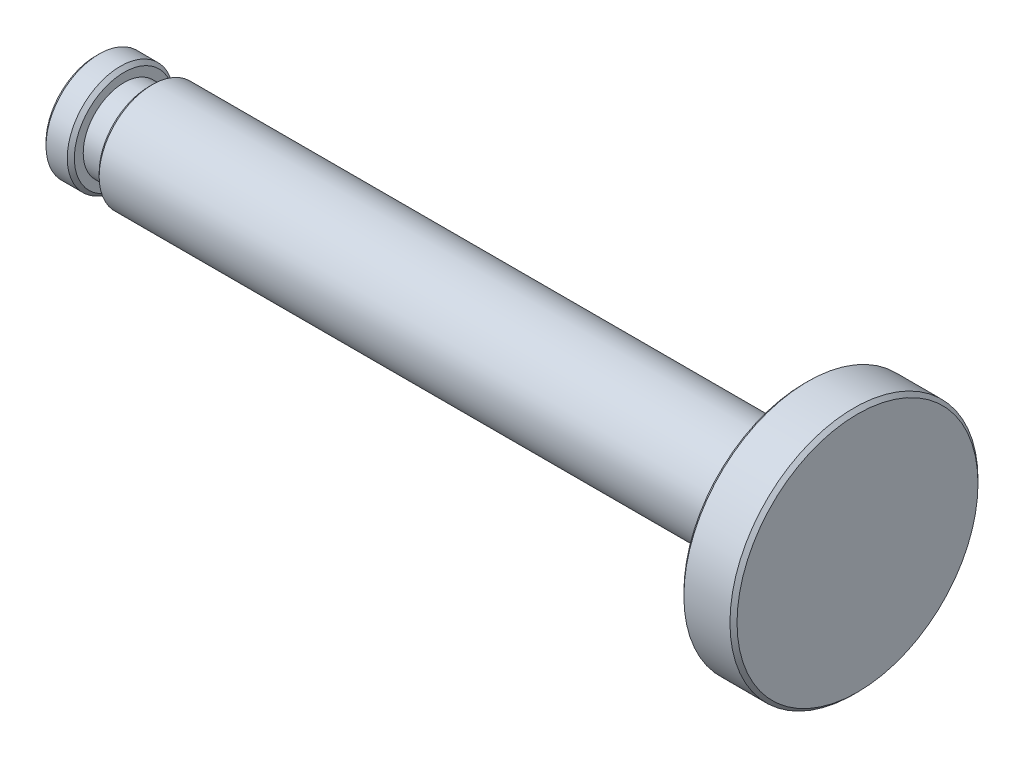
ISO-10303-21;
HEADER;
FILE_DESCRIPTION(('STEP AP214'),'2;1');
FILE_NAME('part.step','',(''),(''),'','','');
FILE_SCHEMA(('AUTOMOTIVE_DESIGN { 1 0 10303 214 1 1 1 1 }'));
ENDSEC;
DATA;
#1=APPLICATION_CONTEXT('core data for automotive mechanical design processes');
#2=APPLICATION_PROTOCOL_DEFINITION('international standard','automotive_design',2000,#1);
#3=PRODUCT_CONTEXT('',#1,'mechanical');
#4=PRODUCT('Part','Part','',(#3));
#5=PRODUCT_RELATED_PRODUCT_CATEGORY('part','',(#4));
#6=PRODUCT_DEFINITION_FORMATION('','',#4);
#7=PRODUCT_DEFINITION_CONTEXT('part definition',#1,'design');
#8=PRODUCT_DEFINITION('design','',#6,#7);
#9=PRODUCT_DEFINITION_SHAPE('','',#8);
#10=(LENGTH_UNIT() NAMED_UNIT(*) SI_UNIT(.MILLI.,.METRE.));
#11=(NAMED_UNIT(*) PLANE_ANGLE_UNIT() SI_UNIT($,.RADIAN.));
#12=(NAMED_UNIT(*) SI_UNIT($,.STERADIAN.) SOLID_ANGLE_UNIT());
#13=UNCERTAINTY_MEASURE_WITH_UNIT(LENGTH_MEASURE(1.E-05),#10,'distance_accuracy_value','');
#14=(GEOMETRIC_REPRESENTATION_CONTEXT(3) GLOBAL_UNCERTAINTY_ASSIGNED_CONTEXT((#13)) GLOBAL_UNIT_ASSIGNED_CONTEXT((#10,
#11,#12)) REPRESENTATION_CONTEXT('',''));
#15=CARTESIAN_POINT('',(0.,0.,0.));
#16=DIRECTION('',(0.,0.,1.));
#17=DIRECTION('',(1.,0.,0.));
#18=AXIS2_PLACEMENT_3D('',#15,#16,#17);
#19=CARTESIAN_POINT('',(-10.75,1.5,0.));
#20=DIRECTION('',(-1.,0.,0.));
#21=DIRECTION('',(0.,0.,1.));
#22=AXIS2_PLACEMENT_3D('',#19,#20,#21);
#23=PLANE('',#22);
#24=CARTESIAN_POINT('',(-10.7499999999732,0.,0.));
#25=DIRECTION('',(1.,0.,0.));
#26=DIRECTION('',(0.,0.,-1.));
#27=AXIS2_PLACEMENT_3D('',#24,#25,#26);
#28=CIRCLE('',#27,1.40000000004648);
#29=CARTESIAN_POINT('',(-10.7499999999732,0.,1.40000000004648));
#30=VERTEX_POINT('',#29);
#31=EDGE_CURVE('E11',#30,#30,#28,.T.);
#32=ORIENTED_EDGE('',*,*,#31,.F.);
#33=EDGE_LOOP('',(#32));
#34=FACE_BOUND('',#33,.T.);
#35=ADVANCED_FACE('F17',(#34),#23,.T.);
#36=CARTESIAN_POINT('',(10.75,3.5,0.));
#37=DIRECTION('',(1.,0.,0.));
#38=DIRECTION('',(0.,1.,0.));
#39=AXIS2_PLACEMENT_3D('',#36,#37,#38);
#40=PLANE('',#39);
#41=CARTESIAN_POINT('',(10.7499999999732,0.,0.));
#42=DIRECTION('',(-1.,0.,0.));
#43=DIRECTION('',(0.,0.,1.));
#44=AXIS2_PLACEMENT_3D('',#41,#42,#43);
#45=CIRCLE('',#44,3.39999999999918);
#46=CARTESIAN_POINT('',(10.7499999999732,0.,-3.39999999999918));
#47=VERTEX_POINT('',#46);
#48=EDGE_CURVE('E98',#47,#47,#45,.T.);
#49=ORIENTED_EDGE('',*,*,#48,.F.);
#50=EDGE_LOOP('',(#49));
#51=FACE_BOUND('',#50,.T.);
#52=ADVANCED_FACE('F196',(#51),#40,.T.);
#53=CARTESIAN_POINT('',(-9.95,1.15,0.));
#54=DIRECTION('',(1.,0.,0.));
#55=DIRECTION('',(0.,1.,0.));
#56=AXIS2_PLACEMENT_3D('',#53,#54,#55);
#57=PLANE('',#56);
#58=CARTESIAN_POINT('',(-9.95,0.,0.));
#59=DIRECTION('',(1.,0.,0.));
#60=DIRECTION('',(0.,0.,-1.));
#61=AXIS2_PLACEMENT_3D('',#58,#59,#60);
#62=CIRCLE('',#61,1.15);
#63=CARTESIAN_POINT('',(-9.95,0.,1.15));
#64=VERTEX_POINT('',#63);
#65=EDGE_CURVE('E120',#64,#64,#62,.T.);
#66=ORIENTED_EDGE('',*,*,#65,.F.);
#67=EDGE_LOOP('',(#66));
#68=FACE_BOUND('',#67,.T.);
#69=CARTESIAN_POINT('',(-9.94999999994661,0.,0.));
#70=DIRECTION('',(1.,0.,0.));
#71=DIRECTION('',(0.,0.,1.));
#72=AXIS2_PLACEMENT_3D('',#69,#70,#71);
#73=CIRCLE('',#72,1.39999999993279);
#74=CARTESIAN_POINT('',(-9.94999999994661,0.,-1.39999999993279));
#75=VERTEX_POINT('',#74);
#76=EDGE_CURVE('E162',#75,#75,#73,.T.);
#77=ORIENTED_EDGE('',*,*,#76,.T.);
#78=EDGE_LOOP('',(#77));
#79=FACE_BOUND('',#78,.T.);
#80=ADVANCED_FACE('F201',(#68,#79),#57,.T.);
#81=CARTESIAN_POINT('',(-9.25,1.5,0.));
#82=DIRECTION('',(-1.,0.,0.));
#83=DIRECTION('',(0.,0.,1.));
#84=AXIS2_PLACEMENT_3D('',#81,#82,#83);
#85=PLANE('',#84);
#86=CARTESIAN_POINT('',(-9.25,0.,0.));
#87=DIRECTION('',(1.,0.,0.));
#88=DIRECTION('',(0.,0.,-1.));
#89=AXIS2_PLACEMENT_3D('',#86,#87,#88);
#90=CIRCLE('',#89,1.15);
#91=CARTESIAN_POINT('',(-9.25,0.,1.15));
#92=VERTEX_POINT('',#91);
#93=EDGE_CURVE('E155',#92,#92,#90,.T.);
#94=ORIENTED_EDGE('',*,*,#93,.T.);
#95=EDGE_LOOP('',(#94));
#96=FACE_BOUND('',#95,.T.);
#97=CARTESIAN_POINT('',(-9.25000000000864,0.,0.));
#98=DIRECTION('',(1.,0.,0.));
#99=DIRECTION('',(0.,0.,-1.));
#100=AXIS2_PLACEMENT_3D('',#97,#98,#99);
#101=CIRCLE('',#100,1.40000000004648);
#102=CARTESIAN_POINT('',(-9.25000000000864,0.,1.40000000004648));
#103=VERTEX_POINT('',#102);
#104=EDGE_CURVE('E20',#103,#103,#101,.T.);
#105=ORIENTED_EDGE('',*,*,#104,.F.);
#106=EDGE_LOOP('',(#105));
#107=FACE_BOUND('',#106,.T.);
#108=ADVANCED_FACE('F190',(#96,#107),#85,.T.);
#109=CARTESIAN_POINT('',(9.25,1.5,0.));
#110=DIRECTION('',(-1.,0.,0.));
#111=DIRECTION('',(0.,0.,1.));
#112=AXIS2_PLACEMENT_3D('',#109,#110,#111);
#113=PLANE('',#112);
#114=CARTESIAN_POINT('',(9.25,0.,0.));
#115=DIRECTION('',(-1.,0.,0.));
#116=DIRECTION('',(0.,0.,-1.));
#117=AXIS2_PLACEMENT_3D('',#114,#115,#116);
#118=CIRCLE('',#117,1.5);
#119=CARTESIAN_POINT('',(9.25,0.,1.5));
#120=VERTEX_POINT('',#119);
#121=EDGE_CURVE('E146',#120,#120,#118,.T.);
#122=ORIENTED_EDGE('',*,*,#121,.F.);
#123=EDGE_LOOP('',(#122));
#124=FACE_BOUND('',#123,.T.);
#125=CARTESIAN_POINT('',(9.25000000000864,0.,0.));
#126=DIRECTION('',(-1.,0.,0.));
#127=DIRECTION('',(0.,0.,-1.));
#128=AXIS2_PLACEMENT_3D('',#125,#126,#127);
#129=CIRCLE('',#128,3.39999999999918);
#130=CARTESIAN_POINT('',(9.25000000000864,0.,3.39999999999918));
#131=VERTEX_POINT('',#130);
#132=EDGE_CURVE('E129',#131,#131,#129,.T.);
#133=ORIENTED_EDGE('',*,*,#132,.T.);
#134=EDGE_LOOP('',(#133));
#135=FACE_BOUND('',#134,.T.);
#136=ADVANCED_FACE('F181',(#124,#135),#113,.T.);
#137=CARTESIAN_POINT('',(-10.650000000112,0.,0.));
#138=DIRECTION('',(1.,0.,0.));
#139=DIRECTION('',(0.,0.,-1.));
#140=AXIS2_PLACEMENT_3D('',#137,#138,#139);
#141=CONICAL_SURFACE('',#140,1.49999999990769,0.785398163397448);
#142=CARTESIAN_POINT('',(-10.65,0.,0.));
#143=DIRECTION('',(1.,0.,0.));
#144=DIRECTION('',(0.,0.,-1.));
#145=AXIS2_PLACEMENT_3D('',#142,#143,#144);
#146=CIRCLE('',#145,1.5);
#147=CARTESIAN_POINT('',(-10.65,0.,1.5));
#148=VERTEX_POINT('',#147);
#149=EDGE_CURVE('E142',#148,#148,#146,.T.);
#150=ORIENTED_EDGE('',*,*,#149,.F.);
#151=DIRECTION('',(-0.707106781186548,0.,-0.707106781186548));
#152=VECTOR('',#151,1.);
#153=CARTESIAN_POINT('',(-10.650000000112,0.,1.49999999990769));
#154=LINE('',#153,#152);
#155=EDGE_CURVE('E26',#148,#30,#154,.T.);
#156=ORIENTED_EDGE('',*,*,#155,.T.);
#157=ORIENTED_EDGE('',*,*,#31,.T.);
#158=ORIENTED_EDGE('',*,*,#155,.F.);
#159=EDGE_LOOP('',(#150,#156,#157,#158));
#160=FACE_BOUND('',#159,.T.);
#161=ADVANCED_FACE('F179',(#160),#141,.T.);
#162=CARTESIAN_POINT('',(43.7434951565,0.,0.));
#163=DIRECTION('',(1.,0.,0.));
#164=DIRECTION('',(0.,0.,-1.));
#165=AXIS2_PLACEMENT_3D('',#162,#163,#164);
#166=CYLINDRICAL_SURFACE('',#165,1.5);
#167=CARTESIAN_POINT('',(-10.0499999999784,0.,0.));
#168=DIRECTION('',(1.,0.,0.));
#169=DIRECTION('',(0.,-1.,0.));
#170=AXIS2_PLACEMENT_3D('',#167,#168,#169);
#171=CIRCLE('',#170,1.49999999996453);
#172=CARTESIAN_POINT('',(-10.0499999999784,0.,1.49999999996453));
#173=VERTEX_POINT('',#172);
#174=CARTESIAN_POINT('',(-10.0499999999784,0.,-1.49999999996453));
#175=VERTEX_POINT('',#174);
#176=EDGE_CURVE('E105',#173,#175,#171,.T.);
#177=ORIENTED_EDGE('',*,*,#176,.F.);
#178=DIRECTION('',(-1.,0.,0.));
#179=VECTOR('',#178,1.);
#180=CARTESIAN_POINT('',(43.7434951565,0.,1.5));
#181=LINE('',#180,#179);
#182=EDGE_CURVE('E147',#173,#148,#181,.T.);
#183=ORIENTED_EDGE('',*,*,#182,.T.);
#184=ORIENTED_EDGE('',*,*,#149,.T.);
#185=ORIENTED_EDGE('',*,*,#182,.F.);
#186=CARTESIAN_POINT('',(-10.0499999999784,0.,0.));
#187=DIRECTION('',(1.,0.,0.));
#188=DIRECTION('',(0.,-1.,0.));
#189=AXIS2_PLACEMENT_3D('',#186,#187,#188);
#190=CIRCLE('',#189,1.49999999996453);
#191=EDGE_CURVE('E151',#175,#173,#190,.T.);
#192=ORIENTED_EDGE('',*,*,#191,.F.);
#193=EDGE_LOOP('',(#177,#183,#184,#185,#192));
#194=FACE_BOUND('',#193,.T.);
#195=ADVANCED_FACE('F178',(#194),#166,.T.);
#196=CARTESIAN_POINT('',(-10.0499999999215,0.,0.));
#197=DIRECTION('',(-1.,0.,0.));
#198=DIRECTION('',(0.,0.,1.));
#199=AXIS2_PLACEMENT_3D('',#196,#197,#198);
#200=CONICAL_SURFACE('',#199,1.49999999990769,0.785398163397448);
#201=ORIENTED_EDGE('',*,*,#176,.T.);
#202=DIRECTION('',(0.707106781186548,0.,0.707106781186548));
#203=VECTOR('',#202,1.);
#204=CARTESIAN_POINT('',(-10.0499999999215,0.,-1.49999999990769));
#205=LINE('',#204,#203);
#206=EDGE_CURVE('E113',#175,#75,#205,.T.);
#207=ORIENTED_EDGE('',*,*,#206,.T.);
#208=ORIENTED_EDGE('',*,*,#76,.F.);
#209=ORIENTED_EDGE('',*,*,#206,.F.);
#210=ORIENTED_EDGE('',*,*,#191,.T.);
#211=EDGE_LOOP('',(#201,#207,#208,#209,#210));
#212=FACE_BOUND('',#211,.T.);
#213=ADVANCED_FACE('F188',(#212),#200,.T.);
#214=CARTESIAN_POINT('',(10.6500000000551,0.,0.));
#215=DIRECTION('',(-1.,0.,0.));
#216=DIRECTION('',(0.,0.,1.));
#217=AXIS2_PLACEMENT_3D('',#214,#215,#216);
#218=CONICAL_SURFACE('',#217,3.49999999997408,0.785398163681665);
#219=CARTESIAN_POINT('',(10.65,0.,0.));
#220=DIRECTION('',(-1.,0.,0.));
#221=DIRECTION('',(0.,0.,-1.));
#222=AXIS2_PLACEMENT_3D('',#219,#220,#221);
#223=CIRCLE('',#222,3.5);
#224=CARTESIAN_POINT('',(10.65,0.,-3.5000000000292));
#225=VERTEX_POINT('',#224);
#226=CARTESIAN_POINT('',(10.65,0.,3.5));
#227=VERTEX_POINT('',#226);
#228=EDGE_CURVE('E123',#225,#227,#223,.T.);
#229=ORIENTED_EDGE('',*,*,#228,.F.);
#230=DIRECTION('',(0.707106780985576,0.,0.707106781387519));
#231=VECTOR('',#230,1.);
#232=CARTESIAN_POINT('',(10.6500000000551,0.,-3.49999999997408));
#233=LINE('',#232,#231);
#234=EDGE_CURVE('E101',#225,#47,#233,.T.);
#235=ORIENTED_EDGE('',*,*,#234,.T.);
#236=ORIENTED_EDGE('',*,*,#48,.T.);
#237=ORIENTED_EDGE('',*,*,#234,.F.);
#238=CARTESIAN_POINT('',(10.65,0.,0.));
#239=DIRECTION('',(-1.,0.,0.));
#240=DIRECTION('',(0.,0.,-1.));
#241=AXIS2_PLACEMENT_3D('',#238,#239,#240);
#242=CIRCLE('',#241,3.5);
#243=EDGE_CURVE('E115',#227,#225,#242,.T.);
#244=ORIENTED_EDGE('',*,*,#243,.F.);
#245=EDGE_LOOP('',(#229,#235,#236,#237,#244));
#246=FACE_BOUND('',#245,.T.);
#247=ADVANCED_FACE('F100',(#246),#218,.T.);
#248=CARTESIAN_POINT('',(43.7434951565,0.,0.));
#249=DIRECTION('',(1.,0.,0.));
#250=DIRECTION('',(0.,0.,-1.));
#251=AXIS2_PLACEMENT_3D('',#248,#249,#250);
#252=CYLINDRICAL_SURFACE('',#251,3.5);
#253=ORIENTED_EDGE('',*,*,#228,.T.);
#254=DIRECTION('',(-1.,0.,0.));
#255=VECTOR('',#254,1.);
#256=CARTESIAN_POINT('',(43.7434951565,0.,3.5));
#257=LINE('',#256,#255);
#258=CARTESIAN_POINT('',(9.34999999998354,0.,3.49999999997408));
#259=VERTEX_POINT('',#258);
#260=EDGE_CURVE('E161',#227,#259,#257,.T.);
#261=ORIENTED_EDGE('',*,*,#260,.T.);
#262=CARTESIAN_POINT('',(9.34999999998354,0.,0.));
#263=DIRECTION('',(-1.,0.,0.));
#264=DIRECTION('',(0.,1.,0.));
#265=AXIS2_PLACEMENT_3D('',#262,#263,#264);
#266=CIRCLE('',#265,3.49999999997408);
#267=EDGE_CURVE('E130',#259,#259,#266,.T.);
#268=ORIENTED_EDGE('',*,*,#267,.F.);
#269=ORIENTED_EDGE('',*,*,#260,.F.);
#270=ORIENTED_EDGE('',*,*,#243,.T.);
#271=EDGE_LOOP('',(#253,#261,#268,#269,#270));
#272=FACE_BOUND('',#271,.T.);
#273=ADVANCED_FACE('F214',(#272),#252,.T.);
#274=CARTESIAN_POINT('',(43.7434951565,0.,0.));
#275=DIRECTION('',(1.,0.,0.));
#276=DIRECTION('',(0.,0.,-1.));
#277=AXIS2_PLACEMENT_3D('',#274,#275,#276);
#278=CYLINDRICAL_SURFACE('',#277,1.15);
#279=ORIENTED_EDGE('',*,*,#93,.F.);
#280=DIRECTION('',(-1.,0.,0.));
#281=VECTOR('',#280,1.);
#282=CARTESIAN_POINT('',(43.7434951565,0.,1.15));
#283=LINE('',#282,#281);
#284=EDGE_CURVE('E124',#92,#64,#283,.T.);
#285=ORIENTED_EDGE('',*,*,#284,.T.);
#286=ORIENTED_EDGE('',*,*,#65,.T.);
#287=ORIENTED_EDGE('',*,*,#284,.F.);
#288=EDGE_LOOP('',(#279,#285,#286,#287));
#289=FACE_BOUND('',#288,.T.);
#290=ADVANCED_FACE('F211',(#289),#278,.T.);
#291=CARTESIAN_POINT('',(9.34999999986985,0.,0.));
#292=DIRECTION('',(1.,0.,0.));
#293=DIRECTION('',(0.,0.,-1.));
#294=AXIS2_PLACEMENT_3D('',#291,#292,#293);
#295=CONICAL_SURFACE('',#294,3.49999999986039,0.785398163397448);
#296=ORIENTED_EDGE('',*,*,#267,.T.);
#297=DIRECTION('',(-0.707106781186548,0.,-0.707106781186548));
#298=VECTOR('',#297,1.);
#299=CARTESIAN_POINT('',(9.34999999986985,0.,3.49999999986039));
#300=LINE('',#299,#298);
#301=EDGE_CURVE('E125',#259,#131,#300,.T.);
#302=ORIENTED_EDGE('',*,*,#301,.T.);
#303=ORIENTED_EDGE('',*,*,#132,.F.);
#304=ORIENTED_EDGE('',*,*,#301,.F.);
#305=EDGE_LOOP('',(#296,#302,#303,#304));
#306=FACE_BOUND('',#305,.T.);
#307=ADVANCED_FACE('F209',(#306),#295,.T.);
#308=CARTESIAN_POINT('',(-9.15000000014743,0.,0.));
#309=DIRECTION('',(1.,0.,0.));
#310=DIRECTION('',(0.,0.,-1.));
#311=AXIS2_PLACEMENT_3D('',#308,#309,#310);
#312=CONICAL_SURFACE('',#311,1.49999999990769,0.785398163397448);
#313=CARTESIAN_POINT('',(-9.15,0.,0.));
#314=DIRECTION('',(1.,0.,0.));
#315=DIRECTION('',(0.,0.,-1.));
#316=AXIS2_PLACEMENT_3D('',#313,#314,#315);
#317=CIRCLE('',#316,1.5);
#318=CARTESIAN_POINT('',(-9.15,0.,1.5));
#319=VERTEX_POINT('',#318);
#320=EDGE_CURVE('E131',#319,#319,#317,.T.);
#321=ORIENTED_EDGE('',*,*,#320,.F.);
#322=DIRECTION('',(-0.707106781186548,0.,-0.707106781186548));
#323=VECTOR('',#322,1.);
#324=CARTESIAN_POINT('',(-9.15000000014743,0.,1.49999999990769));
#325=LINE('',#324,#323);
#326=EDGE_CURVE('E135',#319,#103,#325,.T.);
#327=ORIENTED_EDGE('',*,*,#326,.T.);
#328=ORIENTED_EDGE('',*,*,#104,.T.);
#329=ORIENTED_EDGE('',*,*,#326,.F.);
#330=EDGE_LOOP('',(#321,#327,#328,#329));
#331=FACE_BOUND('',#330,.T.);
#332=ADVANCED_FACE('F224',(#331),#312,.T.);
#333=CARTESIAN_POINT('',(43.7434951565,0.,0.));
#334=DIRECTION('',(1.,0.,0.));
#335=DIRECTION('',(0.,0.,-1.));
#336=AXIS2_PLACEMENT_3D('',#333,#334,#335);
#337=CYLINDRICAL_SURFACE('',#336,1.5);
#338=ORIENTED_EDGE('',*,*,#121,.T.);
#339=DIRECTION('',(-1.,0.,0.));
#340=VECTOR('',#339,1.);
#341=CARTESIAN_POINT('',(43.7434951565,0.,1.5));
#342=LINE('',#341,#340);
#343=EDGE_CURVE('E136',#120,#319,#342,.T.);
#344=ORIENTED_EDGE('',*,*,#343,.T.);
#345=ORIENTED_EDGE('',*,*,#320,.T.);
#346=ORIENTED_EDGE('',*,*,#343,.F.);
#347=EDGE_LOOP('',(#338,#344,#345,#346));
#348=FACE_BOUND('',#347,.T.);
#349=ADVANCED_FACE('F222',(#348),#337,.T.);
#350=CLOSED_SHELL('',(#35,#52,#80,#108,#136,#161,#195,#213,#247,#273,#290,#307,#332,#349));
#351=MANIFOLD_SOLID_BREP('B1',#350);
#352=ADVANCED_BREP_SHAPE_REPRESENTATION('',(#18,#351),#14);
#353=SHAPE_DEFINITION_REPRESENTATION(#9,#352);
ENDSEC;
END-ISO-10303-21;
